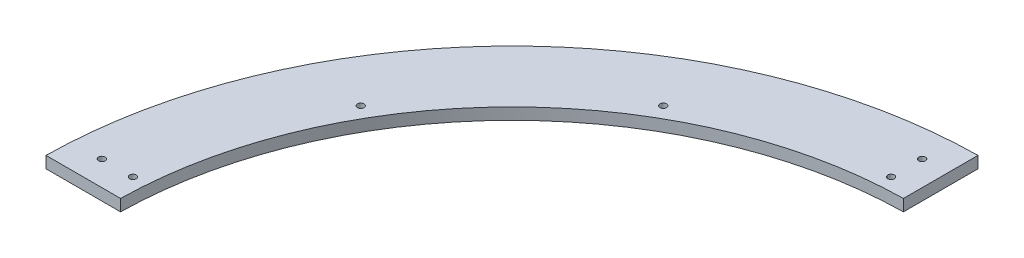
ISO-10303-21;
HEADER;
FILE_DESCRIPTION(('STEP AP214'),'2;1');
FILE_NAME('part.step','',(''),(''),'','','');
FILE_SCHEMA(('AUTOMOTIVE_DESIGN { 1 0 10303 214 1 1 1 1 }'));
ENDSEC;
DATA;
#1=APPLICATION_CONTEXT('core data for automotive mechanical design processes');
#2=APPLICATION_PROTOCOL_DEFINITION('international standard','automotive_design',2000,#1);
#3=PRODUCT_CONTEXT('',#1,'mechanical');
#4=PRODUCT('Part','Part','',(#3));
#5=PRODUCT_RELATED_PRODUCT_CATEGORY('part','',(#4));
#6=PRODUCT_DEFINITION_FORMATION('','',#4);
#7=PRODUCT_DEFINITION_CONTEXT('part definition',#1,'design');
#8=PRODUCT_DEFINITION('design','',#6,#7);
#9=PRODUCT_DEFINITION_SHAPE('','',#8);
#10=(LENGTH_UNIT() NAMED_UNIT(*) SI_UNIT(.MILLI.,.METRE.));
#11=(NAMED_UNIT(*) PLANE_ANGLE_UNIT() SI_UNIT($,.RADIAN.));
#12=(NAMED_UNIT(*) SI_UNIT($,.STERADIAN.) SOLID_ANGLE_UNIT());
#13=UNCERTAINTY_MEASURE_WITH_UNIT(LENGTH_MEASURE(1.E-05),#10,'distance_accuracy_value','');
#14=(GEOMETRIC_REPRESENTATION_CONTEXT(3) GLOBAL_UNCERTAINTY_ASSIGNED_CONTEXT((#13)) GLOBAL_UNIT_ASSIGNED_CONTEXT((#10,
#11,#12)) REPRESENTATION_CONTEXT('',''));
#15=CARTESIAN_POINT('',(0.,0.,0.));
#16=DIRECTION('',(0.,0.,1.));
#17=DIRECTION('',(1.,0.,0.));
#18=AXIS2_PLACEMENT_3D('',#15,#16,#17);
#19=CARTESIAN_POINT('',(0.,11.90625,0.));
#20=DIRECTION('',(0.,-1.,0.));
#21=DIRECTION('',(0.,0.,-1.));
#22=AXIS2_PLACEMENT_3D('',#19,#20,#21);
#23=CYLINDRICAL_SURFACE('',#22,406.4);
#24=CARTESIAN_POINT('',(0.,0.,0.));
#25=DIRECTION('',(0.,-1.,0.));
#26=DIRECTION('',(0.,0.,-1.));
#27=AXIS2_PLACEMENT_3D('',#24,#25,#26);
#28=CIRCLE('',#27,406.4);
#29=CARTESIAN_POINT('',(-406.350387596714,0.,-6.34999999999993));
#30=VERTEX_POINT('',#29);
#31=CARTESIAN_POINT('',(-6.35,0.,-406.350387596714));
#32=VERTEX_POINT('',#31);
#33=EDGE_CURVE('E135',#30,#32,#28,.T.);
#34=ORIENTED_EDGE('',*,*,#33,.T.);
#35=DIRECTION('',(0.,1.,0.));
#36=VECTOR('',#35,1.);
#37=CARTESIAN_POINT('',(-6.35,0.,-406.350387596714));
#38=LINE('',#37,#36);
#39=CARTESIAN_POINT('',(-6.35,11.90625,-406.350387596714));
#40=VERTEX_POINT('',#39);
#41=EDGE_CURVE('E50',#32,#40,#38,.T.);
#42=ORIENTED_EDGE('',*,*,#41,.T.);
#43=CARTESIAN_POINT('',(0.,11.90625,0.));
#44=DIRECTION('',(0.,-1.,0.));
#45=DIRECTION('',(0.,0.,-1.));
#46=AXIS2_PLACEMENT_3D('',#43,#44,#45);
#47=CIRCLE('',#46,406.4);
#48=CARTESIAN_POINT('',(-406.350387596714,11.90625,-6.34999999999993));
#49=VERTEX_POINT('',#48);
#50=EDGE_CURVE('E41',#49,#40,#47,.T.);
#51=ORIENTED_EDGE('',*,*,#50,.F.);
#52=DIRECTION('',(0.,1.,0.));
#53=VECTOR('',#52,1.);
#54=CARTESIAN_POINT('',(-406.350387596714,0.,-6.34999999999993));
#55=LINE('',#54,#53);
#56=EDGE_CURVE('E65',#30,#49,#55,.T.);
#57=ORIENTED_EDGE('',*,*,#56,.F.);
#58=EDGE_LOOP('',(#34,#42,#51,#57));
#59=FACE_BOUND('',#58,.T.);
#60=ADVANCED_FACE('F32',(#59),#23,.F.);
#61=CARTESIAN_POINT('',(0.,11.90625,0.));
#62=DIRECTION('',(0.,-1.,0.));
#63=DIRECTION('',(0.,0.,-1.));
#64=AXIS2_PLACEMENT_3D('',#61,#62,#63);
#65=CYLINDRICAL_SURFACE('',#64,482.6);
#66=CARTESIAN_POINT('',(0.,11.90625,0.));
#67=DIRECTION('',(0.,1.,0.));
#68=DIRECTION('',(0.,0.,-1.));
#69=AXIS2_PLACEMENT_3D('',#66,#67,#68);
#70=CIRCLE('',#69,482.6);
#71=CARTESIAN_POINT('',(-6.35,11.90625,-482.558221875869));
#72=VERTEX_POINT('',#71);
#73=CARTESIAN_POINT('',(-482.558221875869,11.90625,-6.34999999999993));
#74=VERTEX_POINT('',#73);
#75=EDGE_CURVE('E11',#72,#74,#70,.T.);
#76=ORIENTED_EDGE('',*,*,#75,.F.);
#77=DIRECTION('',(0.,-1.,0.));
#78=VECTOR('',#77,1.);
#79=CARTESIAN_POINT('',(-6.35,11.90625,-482.558221875869));
#80=LINE('',#79,#78);
#81=CARTESIAN_POINT('',(-6.35,0.,-482.558221875869));
#82=VERTEX_POINT('',#81);
#83=EDGE_CURVE('E88',#72,#82,#80,.T.);
#84=ORIENTED_EDGE('',*,*,#83,.T.);
#85=CARTESIAN_POINT('',(0.,0.,0.));
#86=DIRECTION('',(0.,1.,0.));
#87=DIRECTION('',(0.,0.,-1.));
#88=AXIS2_PLACEMENT_3D('',#85,#86,#87);
#89=CIRCLE('',#88,482.6);
#90=CARTESIAN_POINT('',(-482.558221875869,0.,-6.34999999999993));
#91=VERTEX_POINT('',#90);
#92=EDGE_CURVE('E35',#82,#91,#89,.T.);
#93=ORIENTED_EDGE('',*,*,#92,.T.);
#94=DIRECTION('',(0.,-1.,0.));
#95=VECTOR('',#94,1.);
#96=CARTESIAN_POINT('',(-482.558221875869,11.90625,-6.34999999999993));
#97=LINE('',#96,#95);
#98=EDGE_CURVE('E92',#91,#74,#97,.F.);
#99=ORIENTED_EDGE('',*,*,#98,.T.);
#100=EDGE_LOOP('',(#76,#84,#93,#99));
#101=FACE_BOUND('',#100,.T.);
#102=ADVANCED_FACE('F94',(#101),#65,.T.);
#103=CARTESIAN_POINT('',(0.,11.90625,0.));
#104=DIRECTION('',(0.,-1.,0.));
#105=DIRECTION('',(0.,0.,-1.));
#106=AXIS2_PLACEMENT_3D('',#103,#104,#105);
#107=PLANE('',#106);
#108=CARTESIAN_POINT('',(-31.75,11.90625,-419.1));
#109=DIRECTION('',(0.,1.,0.));
#110=DIRECTION('',(0.,0.,1.));
#111=AXIS2_PLACEMENT_3D('',#108,#109,#110);
#112=CIRCLE('',#111,3.3782);
#113=CARTESIAN_POINT('',(-31.75,11.90625,-415.7218));
#114=VERTEX_POINT('',#113);
#115=EDGE_CURVE('E95',#114,#114,#112,.T.);
#116=ORIENTED_EDGE('',*,*,#115,.F.);
#117=EDGE_LOOP('',(#116));
#118=FACE_BOUND('',#117,.T.);
#119=CARTESIAN_POINT('',(-31.75,11.90625,-450.85));
#120=DIRECTION('',(0.,1.,0.));
#121=DIRECTION('',(0.,0.,1.));
#122=AXIS2_PLACEMENT_3D('',#119,#120,#121);
#123=CIRCLE('',#122,3.3782);
#124=CARTESIAN_POINT('',(-31.75,11.90625,-447.4718));
#125=VERTEX_POINT('',#124);
#126=EDGE_CURVE('E103',#125,#125,#123,.T.);
#127=ORIENTED_EDGE('',*,*,#126,.F.);
#128=EDGE_LOOP('',(#127));
#129=FACE_BOUND('',#128,.T.);
#130=CARTESIAN_POINT('',(-419.1,11.90625,-31.75));
#131=DIRECTION('',(0.,1.,0.));
#132=DIRECTION('',(0.,0.,1.));
#133=AXIS2_PLACEMENT_3D('',#130,#131,#132);
#134=CIRCLE('',#133,3.3782);
#135=CARTESIAN_POINT('',(-419.1,11.90625,-28.3718));
#136=VERTEX_POINT('',#135);
#137=EDGE_CURVE('E109',#136,#136,#134,.T.);
#138=ORIENTED_EDGE('',*,*,#137,.F.);
#139=EDGE_LOOP('',(#138));
#140=FACE_BOUND('',#139,.T.);
#141=CARTESIAN_POINT('',(-450.85,11.90625,-31.75));
#142=DIRECTION('',(0.,1.,0.));
#143=DIRECTION('',(0.,0.,1.));
#144=AXIS2_PLACEMENT_3D('',#141,#142,#143);
#145=CIRCLE('',#144,3.3782);
#146=CARTESIAN_POINT('',(-450.85,11.90625,-28.3718));
#147=VERTEX_POINT('',#146);
#148=EDGE_CURVE('E115',#147,#147,#145,.T.);
#149=ORIENTED_EDGE('',*,*,#148,.F.);
#150=EDGE_LOOP('',(#149));
#151=FACE_BOUND('',#150,.T.);
#152=CARTESIAN_POINT('',(-211.1375,11.90625,-365.700877383074));
#153=DIRECTION('',(0.,1.,0.));
#154=DIRECTION('',(0.,0.,1.));
#155=AXIS2_PLACEMENT_3D('',#152,#153,#154);
#156=CIRCLE('',#155,3.3782);
#157=CARTESIAN_POINT('',(-211.1375,11.90625,-362.322677383074));
#158=VERTEX_POINT('',#157);
#159=EDGE_CURVE('E121',#158,#158,#156,.T.);
#160=ORIENTED_EDGE('',*,*,#159,.F.);
#161=EDGE_LOOP('',(#160));
#162=FACE_BOUND('',#161,.T.);
#163=CARTESIAN_POINT('',(-365.700877383074,11.90625,-211.1375));
#164=DIRECTION('',(0.,1.,0.));
#165=DIRECTION('',(0.,0.,1.));
#166=AXIS2_PLACEMENT_3D('',#163,#164,#165);
#167=CIRCLE('',#166,3.3782);
#168=CARTESIAN_POINT('',(-365.700877383074,11.90625,-207.7593));
#169=VERTEX_POINT('',#168);
#170=EDGE_CURVE('E127',#169,#169,#167,.T.);
#171=ORIENTED_EDGE('',*,*,#170,.F.);
#172=EDGE_LOOP('',(#171));
#173=FACE_BOUND('',#172,.T.);
#174=DIRECTION('',(0.,0.,1.));
#175=VECTOR('',#174,1.);
#176=CARTESIAN_POINT('',(-6.35,11.90625,-406.350387596714));
#177=LINE('',#176,#175);
#178=EDGE_CURVE('E80',#72,#40,#177,.T.);
#179=ORIENTED_EDGE('',*,*,#178,.F.);
#180=ORIENTED_EDGE('',*,*,#75,.T.);
#181=DIRECTION('',(-1.,0.,0.));
#182=VECTOR('',#181,1.);
#183=CARTESIAN_POINT('',(-406.350387596714,11.90625,-6.34999999999993));
#184=LINE('',#183,#182);
#185=EDGE_CURVE('E72',#49,#74,#184,.T.);
#186=ORIENTED_EDGE('',*,*,#185,.F.);
#187=ORIENTED_EDGE('',*,*,#50,.T.);
#188=EDGE_LOOP('',(#179,#180,#186,#187));
#189=FACE_BOUND('',#188,.T.);
#190=ADVANCED_FACE('F82',(#118,#129,#140,#151,#162,#173,#189),#107,.F.);
#191=CARTESIAN_POINT('',(0.,0.,0.));
#192=DIRECTION('',(0.,-1.,0.));
#193=DIRECTION('',(0.,0.,-1.));
#194=AXIS2_PLACEMENT_3D('',#191,#192,#193);
#195=PLANE('',#194);
#196=ORIENTED_EDGE('',*,*,#92,.F.);
#197=DIRECTION('',(0.,0.,1.));
#198=VECTOR('',#197,1.);
#199=CARTESIAN_POINT('',(-6.35,0.,-406.350387596714));
#200=LINE('',#199,#198);
#201=EDGE_CURVE('E85',#82,#32,#200,.T.);
#202=ORIENTED_EDGE('',*,*,#201,.T.);
#203=ORIENTED_EDGE('',*,*,#33,.F.);
#204=DIRECTION('',(-1.,0.,0.));
#205=VECTOR('',#204,1.);
#206=CARTESIAN_POINT('',(-406.350387596714,0.,-6.34999999999993));
#207=LINE('',#206,#205);
#208=EDGE_CURVE('E62',#30,#91,#207,.T.);
#209=ORIENTED_EDGE('',*,*,#208,.T.);
#210=EDGE_LOOP('',(#196,#202,#203,#209));
#211=FACE_BOUND('',#210,.T.);
#212=CARTESIAN_POINT('',(-31.75,0.,-419.1));
#213=DIRECTION('',(0.,1.,0.));
#214=DIRECTION('',(0.,0.,1.));
#215=AXIS2_PLACEMENT_3D('',#212,#213,#214);
#216=CIRCLE('',#215,3.3782);
#217=CARTESIAN_POINT('',(-31.75,0.,-415.7218));
#218=VERTEX_POINT('',#217);
#219=EDGE_CURVE('E98',#218,#218,#216,.T.);
#220=ORIENTED_EDGE('',*,*,#219,.T.);
#221=EDGE_LOOP('',(#220));
#222=FACE_BOUND('',#221,.T.);
#223=CARTESIAN_POINT('',(-31.75,0.,-450.85));
#224=DIRECTION('',(0.,1.,0.));
#225=DIRECTION('',(0.,0.,1.));
#226=AXIS2_PLACEMENT_3D('',#223,#224,#225);
#227=CIRCLE('',#226,3.3782);
#228=CARTESIAN_POINT('',(-31.75,0.,-447.4718));
#229=VERTEX_POINT('',#228);
#230=EDGE_CURVE('E106',#229,#229,#227,.T.);
#231=ORIENTED_EDGE('',*,*,#230,.T.);
#232=EDGE_LOOP('',(#231));
#233=FACE_BOUND('',#232,.T.);
#234=CARTESIAN_POINT('',(-419.1,0.,-31.75));
#235=DIRECTION('',(0.,1.,0.));
#236=DIRECTION('',(0.,0.,1.));
#237=AXIS2_PLACEMENT_3D('',#234,#235,#236);
#238=CIRCLE('',#237,3.3782);
#239=CARTESIAN_POINT('',(-419.1,0.,-28.3718));
#240=VERTEX_POINT('',#239);
#241=EDGE_CURVE('E112',#240,#240,#238,.T.);
#242=ORIENTED_EDGE('',*,*,#241,.T.);
#243=EDGE_LOOP('',(#242));
#244=FACE_BOUND('',#243,.T.);
#245=CARTESIAN_POINT('',(-450.85,0.,-31.75));
#246=DIRECTION('',(0.,1.,0.));
#247=DIRECTION('',(0.,0.,1.));
#248=AXIS2_PLACEMENT_3D('',#245,#246,#247);
#249=CIRCLE('',#248,3.3782);
#250=CARTESIAN_POINT('',(-450.85,0.,-28.3718));
#251=VERTEX_POINT('',#250);
#252=EDGE_CURVE('E118',#251,#251,#249,.T.);
#253=ORIENTED_EDGE('',*,*,#252,.T.);
#254=EDGE_LOOP('',(#253));
#255=FACE_BOUND('',#254,.T.);
#256=CARTESIAN_POINT('',(-211.1375,0.,-365.700877383074));
#257=DIRECTION('',(0.,1.,0.));
#258=DIRECTION('',(0.,0.,1.));
#259=AXIS2_PLACEMENT_3D('',#256,#257,#258);
#260=CIRCLE('',#259,3.3782);
#261=CARTESIAN_POINT('',(-211.1375,0.,-362.322677383074));
#262=VERTEX_POINT('',#261);
#263=EDGE_CURVE('E124',#262,#262,#260,.T.);
#264=ORIENTED_EDGE('',*,*,#263,.T.);
#265=EDGE_LOOP('',(#264));
#266=FACE_BOUND('',#265,.T.);
#267=CARTESIAN_POINT('',(-365.700877383074,0.,-211.1375));
#268=DIRECTION('',(0.,1.,0.));
#269=DIRECTION('',(0.,0.,1.));
#270=AXIS2_PLACEMENT_3D('',#267,#268,#269);
#271=CIRCLE('',#270,3.3782);
#272=CARTESIAN_POINT('',(-365.700877383074,0.,-207.7593));
#273=VERTEX_POINT('',#272);
#274=EDGE_CURVE('E130',#273,#273,#271,.T.);
#275=ORIENTED_EDGE('',*,*,#274,.T.);
#276=EDGE_LOOP('',(#275));
#277=FACE_BOUND('',#276,.T.);
#278=ADVANCED_FACE('F141',(#211,#222,#233,#244,#255,#266,#277),#195,.T.);
#279=CARTESIAN_POINT('',(-406.350387596714,0.,-6.34999999999993));
#280=DIRECTION('',(0.,0.,-1.));
#281=DIRECTION('',(-1.,0.,0.));
#282=AXIS2_PLACEMENT_3D('',#279,#280,#281);
#283=PLANE('',#282);
#284=ORIENTED_EDGE('',*,*,#185,.T.);
#285=ORIENTED_EDGE('',*,*,#98,.F.);
#286=ORIENTED_EDGE('',*,*,#208,.F.);
#287=ORIENTED_EDGE('',*,*,#56,.T.);
#288=EDGE_LOOP('',(#284,#285,#286,#287));
#289=FACE_BOUND('',#288,.T.);
#290=ADVANCED_FACE('F144',(#289),#283,.F.);
#291=CARTESIAN_POINT('',(-6.35,0.,-406.350387596714));
#292=DIRECTION('',(-1.,0.,0.));
#293=DIRECTION('',(0.,0.,1.));
#294=AXIS2_PLACEMENT_3D('',#291,#292,#293);
#295=PLANE('',#294);
#296=ORIENTED_EDGE('',*,*,#178,.T.);
#297=ORIENTED_EDGE('',*,*,#41,.F.);
#298=ORIENTED_EDGE('',*,*,#201,.F.);
#299=ORIENTED_EDGE('',*,*,#83,.F.);
#300=EDGE_LOOP('',(#296,#297,#298,#299));
#301=FACE_BOUND('',#300,.T.);
#302=ADVANCED_FACE('F89',(#301),#295,.F.);
#303=CARTESIAN_POINT('',(-365.700877383074,11.90625,-211.1375));
#304=DIRECTION('',(0.,1.,0.));
#305=DIRECTION('',(0.,0.,1.));
#306=AXIS2_PLACEMENT_3D('',#303,#304,#305);
#307=CYLINDRICAL_SURFACE('',#306,3.3782);
#308=ORIENTED_EDGE('',*,*,#274,.F.);
#309=EDGE_LOOP('',(#308));
#310=FACE_BOUND('',#309,.T.);
#311=ORIENTED_EDGE('',*,*,#170,.T.);
#312=EDGE_LOOP('',(#311));
#313=FACE_BOUND('',#312,.T.);
#314=ADVANCED_FACE('F158',(#310,#313),#307,.F.);
#315=CARTESIAN_POINT('',(-211.1375,11.90625,-365.700877383074));
#316=DIRECTION('',(0.,1.,0.));
#317=DIRECTION('',(0.,0.,1.));
#318=AXIS2_PLACEMENT_3D('',#315,#316,#317);
#319=CYLINDRICAL_SURFACE('',#318,3.3782);
#320=ORIENTED_EDGE('',*,*,#263,.F.);
#321=EDGE_LOOP('',(#320));
#322=FACE_BOUND('',#321,.T.);
#323=ORIENTED_EDGE('',*,*,#159,.T.);
#324=EDGE_LOOP('',(#323));
#325=FACE_BOUND('',#324,.T.);
#326=ADVANCED_FACE('F161',(#322,#325),#319,.F.);
#327=CARTESIAN_POINT('',(-450.85,11.90625,-31.75));
#328=DIRECTION('',(0.,1.,0.));
#329=DIRECTION('',(0.,0.,1.));
#330=AXIS2_PLACEMENT_3D('',#327,#328,#329);
#331=CYLINDRICAL_SURFACE('',#330,3.3782);
#332=ORIENTED_EDGE('',*,*,#252,.F.);
#333=EDGE_LOOP('',(#332));
#334=FACE_BOUND('',#333,.T.);
#335=ORIENTED_EDGE('',*,*,#148,.T.);
#336=EDGE_LOOP('',(#335));
#337=FACE_BOUND('',#336,.T.);
#338=ADVANCED_FACE('F226',(#334,#337),#331,.F.);
#339=CARTESIAN_POINT('',(-419.1,11.90625,-31.75));
#340=DIRECTION('',(0.,1.,0.));
#341=DIRECTION('',(0.,0.,1.));
#342=AXIS2_PLACEMENT_3D('',#339,#340,#341);
#343=CYLINDRICAL_SURFACE('',#342,3.3782);
#344=ORIENTED_EDGE('',*,*,#241,.F.);
#345=EDGE_LOOP('',(#344));
#346=FACE_BOUND('',#345,.T.);
#347=ORIENTED_EDGE('',*,*,#137,.T.);
#348=EDGE_LOOP('',(#347));
#349=FACE_BOUND('',#348,.T.);
#350=ADVANCED_FACE('F234',(#346,#349),#343,.F.);
#351=CARTESIAN_POINT('',(-31.75,11.90625,-450.85));
#352=DIRECTION('',(0.,1.,0.));
#353=DIRECTION('',(0.,0.,1.));
#354=AXIS2_PLACEMENT_3D('',#351,#352,#353);
#355=CYLINDRICAL_SURFACE('',#354,3.3782);
#356=ORIENTED_EDGE('',*,*,#230,.F.);
#357=EDGE_LOOP('',(#356));
#358=FACE_BOUND('',#357,.T.);
#359=ORIENTED_EDGE('',*,*,#126,.T.);
#360=EDGE_LOOP('',(#359));
#361=FACE_BOUND('',#360,.T.);
#362=ADVANCED_FACE('F242',(#358,#361),#355,.F.);
#363=CARTESIAN_POINT('',(-31.75,11.90625,-419.1));
#364=DIRECTION('',(0.,1.,0.));
#365=DIRECTION('',(0.,0.,1.));
#366=AXIS2_PLACEMENT_3D('',#363,#364,#365);
#367=CYLINDRICAL_SURFACE('',#366,3.3782);
#368=ORIENTED_EDGE('',*,*,#219,.F.);
#369=EDGE_LOOP('',(#368));
#370=FACE_BOUND('',#369,.T.);
#371=ORIENTED_EDGE('',*,*,#115,.T.);
#372=EDGE_LOOP('',(#371));
#373=FACE_BOUND('',#372,.T.);
#374=ADVANCED_FACE('F188',(#370,#373),#367,.F.);
#375=CLOSED_SHELL('',(#60,#102,#190,#278,#290,#302,#314,#326,#338,#350,#362,#374));
#376=MANIFOLD_SOLID_BREP('B2',#375);
#377=ADVANCED_BREP_SHAPE_REPRESENTATION('',(#18,#376),#14);
#378=SHAPE_DEFINITION_REPRESENTATION(#9,#377);
ENDSEC;
END-ISO-10303-21;
